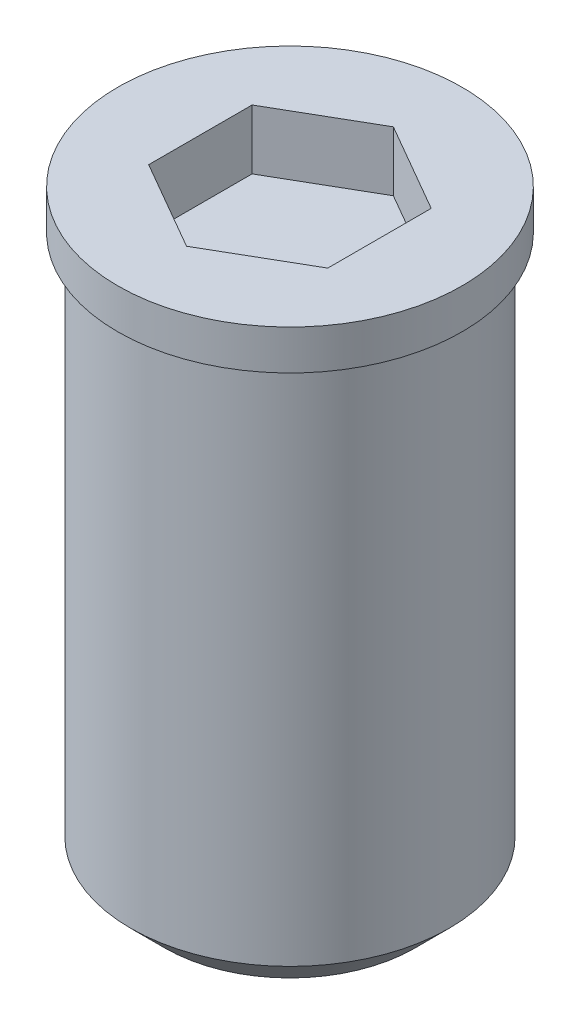
ISO-10303-21;
HEADER;
FILE_DESCRIPTION(('STEP AP214'),'2;1');
FILE_NAME('part.step','',(''),(''),'','','');
FILE_SCHEMA(('AUTOMOTIVE_DESIGN { 1 0 10303 214 1 1 1 1 }'));
ENDSEC;
DATA;
#1=APPLICATION_CONTEXT('core data for automotive mechanical design processes');
#2=APPLICATION_PROTOCOL_DEFINITION('international standard','automotive_design',2000,#1);
#3=PRODUCT_CONTEXT('',#1,'mechanical');
#4=PRODUCT('Part','Part','',(#3));
#5=PRODUCT_RELATED_PRODUCT_CATEGORY('part','',(#4));
#6=PRODUCT_DEFINITION_FORMATION('','',#4);
#7=PRODUCT_DEFINITION_CONTEXT('part definition',#1,'design');
#8=PRODUCT_DEFINITION('design','',#6,#7);
#9=PRODUCT_DEFINITION_SHAPE('','',#8);
#10=(LENGTH_UNIT() NAMED_UNIT(*) SI_UNIT(.MILLI.,.METRE.));
#11=(NAMED_UNIT(*) PLANE_ANGLE_UNIT() SI_UNIT($,.RADIAN.));
#12=(NAMED_UNIT(*) SI_UNIT($,.STERADIAN.) SOLID_ANGLE_UNIT());
#13=UNCERTAINTY_MEASURE_WITH_UNIT(LENGTH_MEASURE(1.E-05),#10,'distance_accuracy_value','');
#14=(GEOMETRIC_REPRESENTATION_CONTEXT(3) GLOBAL_UNCERTAINTY_ASSIGNED_CONTEXT((#13)) GLOBAL_UNIT_ASSIGNED_CONTEXT((#10,
#11,#12)) REPRESENTATION_CONTEXT('',''));
#15=CARTESIAN_POINT('',(0.,0.,0.));
#16=DIRECTION('',(0.,0.,1.));
#17=DIRECTION('',(1.,0.,0.));
#18=AXIS2_PLACEMENT_3D('',#15,#16,#17);
#19=CARTESIAN_POINT('',(0.,0.5,0.));
#20=DIRECTION('',(0.,-1.,0.));
#21=DIRECTION('',(0.,0.,-1.));
#22=AXIS2_PLACEMENT_3D('',#19,#20,#21);
#23=PLANE('',#22);
#24=DIRECTION('',(0.,0.,1.));
#25=VECTOR('',#24,1.);
#26=CARTESIAN_POINT('',(-1.125,0.5,-0.64951905283833));
#27=LINE('',#26,#25);
#28=CARTESIAN_POINT('',(-1.125,0.5,-0.64951905283833));
#29=VERTEX_POINT('',#28);
#30=CARTESIAN_POINT('',(-1.125,0.5,0.64951905283833));
#31=VERTEX_POINT('',#30);
#32=EDGE_CURVE('E122',#29,#31,#27,.T.);
#33=ORIENTED_EDGE('',*,*,#32,.F.);
#34=DIRECTION('',(-0.866025403784425,0.,0.500000000000024));
#35=VECTOR('',#34,1.);
#36=CARTESIAN_POINT('',(0.,0.5,-1.2990381056767));
#37=LINE('',#36,#35);
#38=CARTESIAN_POINT('',(0.,0.5,-1.2990381056767));
#39=VERTEX_POINT('',#38);
#40=EDGE_CURVE('E48',#39,#29,#37,.T.);
#41=ORIENTED_EDGE('',*,*,#40,.F.);
#42=DIRECTION('',(-0.866025403784425,0.,-0.500000000000024));
#43=VECTOR('',#42,1.);
#44=CARTESIAN_POINT('',(1.125,0.5,-0.64951905283833));
#45=LINE('',#44,#43);
#46=CARTESIAN_POINT('',(1.125,0.5,-0.64951905283833));
#47=VERTEX_POINT('',#46);
#48=EDGE_CURVE('E131',#47,#39,#45,.T.);
#49=ORIENTED_EDGE('',*,*,#48,.F.);
#50=DIRECTION('',(0.,0.,-1.));
#51=VECTOR('',#50,1.);
#52=CARTESIAN_POINT('',(1.125,0.5,0.64951905283833));
#53=LINE('',#52,#51);
#54=CARTESIAN_POINT('',(1.125,0.5,0.64951905283833));
#55=VERTEX_POINT('',#54);
#56=EDGE_CURVE('E129',#55,#47,#53,.T.);
#57=ORIENTED_EDGE('',*,*,#56,.F.);
#58=DIRECTION('',(0.866025403784425,0.,-0.500000000000024));
#59=VECTOR('',#58,1.);
#60=CARTESIAN_POINT('',(0.,0.5,1.2990381056767));
#61=LINE('',#60,#59);
#62=CARTESIAN_POINT('',(0.,0.5,1.2990381056767));
#63=VERTEX_POINT('',#62);
#64=EDGE_CURVE('E96',#63,#55,#61,.T.);
#65=ORIENTED_EDGE('',*,*,#64,.F.);
#66=DIRECTION('',(0.866025403784425,0.,0.500000000000024));
#67=VECTOR('',#66,1.);
#68=CARTESIAN_POINT('',(-1.125,0.5,0.64951905283833));
#69=LINE('',#68,#67);
#70=EDGE_CURVE('E125',#31,#63,#69,.T.);
#71=ORIENTED_EDGE('',*,*,#70,.F.);
#72=EDGE_LOOP('',(#33,#41,#49,#57,#65,#71));
#73=FACE_BOUND('',#72,.T.);
#74=CARTESIAN_POINT('',(0.,0.5,0.));
#75=DIRECTION('',(0.,1.,0.));
#76=DIRECTION('',(0.,0.,1.));
#77=AXIS2_PLACEMENT_3D('',#74,#75,#76);
#78=CIRCLE('',#77,2.1621621621622);
#79=CARTESIAN_POINT('',(0.,0.5,2.1621621621622));
#80=VERTEX_POINT('',#79);
#81=EDGE_CURVE('E11',#80,#80,#78,.T.);
#82=ORIENTED_EDGE('',*,*,#81,.T.);
#83=EDGE_LOOP('',(#82));
#84=FACE_BOUND('',#83,.T.);
#85=ADVANCED_FACE('F34',(#73,#84),#23,.F.);
#86=CARTESIAN_POINT('',(0.,-7.,0.));
#87=DIRECTION('',(0.,1.,0.));
#88=DIRECTION('',(0.,0.,1.));
#89=AXIS2_PLACEMENT_3D('',#86,#87,#88);
#90=CYLINDRICAL_SURFACE('',#89,2.1621621621622);
#91=ORIENTED_EDGE('',*,*,#81,.F.);
#92=EDGE_LOOP('',(#91));
#93=FACE_BOUND('',#92,.T.);
#94=CARTESIAN_POINT('',(0.,0.,0.));
#95=DIRECTION('',(0.,1.,0.));
#96=DIRECTION('',(0.,0.,1.));
#97=AXIS2_PLACEMENT_3D('',#94,#95,#96);
#98=CIRCLE('',#97,2.1621621621622);
#99=CARTESIAN_POINT('',(0.,0.,2.1621621621622));
#100=VERTEX_POINT('',#99);
#101=EDGE_CURVE('E41',#100,#100,#98,.T.);
#102=ORIENTED_EDGE('',*,*,#101,.T.);
#103=EDGE_LOOP('',(#102));
#104=FACE_BOUND('',#103,.T.);
#105=ADVANCED_FACE('F151',(#93,#104),#90,.T.);
#106=CARTESIAN_POINT('',(2.1621621621622,0.,0.));
#107=DIRECTION('',(0.,1.,0.));
#108=DIRECTION('',(0.,0.,1.));
#109=AXIS2_PLACEMENT_3D('',#106,#107,#108);
#110=PLANE('',#109);
#111=ORIENTED_EDGE('',*,*,#101,.F.);
#112=EDGE_LOOP('',(#111));
#113=FACE_BOUND('',#112,.T.);
#114=CARTESIAN_POINT('',(0.,0.,0.));
#115=DIRECTION('',(0.,1.,0.));
#116=DIRECTION('',(0.,0.,1.));
#117=AXIS2_PLACEMENT_3D('',#114,#115,#116);
#118=CIRCLE('',#117,2.);
#119=CARTESIAN_POINT('',(0.,0.,2.));
#120=VERTEX_POINT('',#119);
#121=EDGE_CURVE('E146',#120,#120,#118,.T.);
#122=ORIENTED_EDGE('',*,*,#121,.T.);
#123=EDGE_LOOP('',(#122));
#124=FACE_BOUND('',#123,.T.);
#125=ADVANCED_FACE('F153',(#113,#124),#110,.F.);
#126=CARTESIAN_POINT('',(0.,-7.,0.));
#127=DIRECTION('',(0.,1.,0.));
#128=DIRECTION('',(0.,0.,1.));
#129=AXIS2_PLACEMENT_3D('',#126,#127,#128);
#130=CYLINDRICAL_SURFACE('',#129,2.);
#131=ORIENTED_EDGE('',*,*,#121,.F.);
#132=EDGE_LOOP('',(#131));
#133=FACE_BOUND('',#132,.T.);
#134=CARTESIAN_POINT('',(0.,-6.5705,0.));
#135=DIRECTION('',(0.,1.,0.));
#136=DIRECTION('',(0.,0.,1.));
#137=AXIS2_PLACEMENT_3D('',#134,#135,#136);
#138=CIRCLE('',#137,2.);
#139=CARTESIAN_POINT('',(0.,-6.5705,2.));
#140=VERTEX_POINT('',#139);
#141=EDGE_CURVE('E143',#140,#140,#138,.T.);
#142=ORIENTED_EDGE('',*,*,#141,.T.);
#143=EDGE_LOOP('',(#142));
#144=FACE_BOUND('',#143,.T.);
#145=ADVANCED_FACE('F156',(#133,#144),#130,.T.);
#146=CARTESIAN_POINT('',(0.,-7.,0.));
#147=DIRECTION('',(0.,1.,0.));
#148=DIRECTION('',(0.,0.,1.));
#149=AXIS2_PLACEMENT_3D('',#146,#147,#148);
#150=CONICAL_SURFACE('',#149,1.5705,0.785398163397448);
#151=ORIENTED_EDGE('',*,*,#141,.F.);
#152=EDGE_LOOP('',(#151));
#153=FACE_BOUND('',#152,.T.);
#154=CARTESIAN_POINT('',(0.,-7.,0.));
#155=DIRECTION('',(0.,1.,0.));
#156=DIRECTION('',(0.,0.,1.));
#157=AXIS2_PLACEMENT_3D('',#154,#155,#156);
#158=CIRCLE('',#157,1.5705);
#159=CARTESIAN_POINT('',(0.,-7.,1.5705));
#160=VERTEX_POINT('',#159);
#161=EDGE_CURVE('E135',#160,#160,#158,.T.);
#162=ORIENTED_EDGE('',*,*,#161,.T.);
#163=EDGE_LOOP('',(#162));
#164=FACE_BOUND('',#163,.T.);
#165=ADVANCED_FACE('F162',(#153,#164),#150,.T.);
#166=CARTESIAN_POINT('',(1.5705,-7.,0.));
#167=DIRECTION('',(0.,1.,0.));
#168=DIRECTION('',(0.,0.,1.));
#169=AXIS2_PLACEMENT_3D('',#166,#167,#168);
#170=PLANE('',#169);
#171=ORIENTED_EDGE('',*,*,#161,.F.);
#172=EDGE_LOOP('',(#171));
#173=FACE_BOUND('',#172,.T.);
#174=ADVANCED_FACE('F168',(#173),#170,.F.);
#175=CARTESIAN_POINT('',(0.,-0.25,-1.2990381056767));
#176=DIRECTION('',(-0.500000000000024,0.,-0.866025403784425));
#177=DIRECTION('',(-0.866025403784425,0.,0.500000000000024));
#178=AXIS2_PLACEMENT_3D('',#175,#176,#177);
#179=PLANE('',#178);
#180=ORIENTED_EDGE('',*,*,#40,.T.);
#181=DIRECTION('',(0.,1.,0.));
#182=VECTOR('',#181,1.);
#183=CARTESIAN_POINT('',(-1.125,-0.25,-0.64951905283833));
#184=LINE('',#183,#182);
#185=CARTESIAN_POINT('',(-1.125,-0.25,-0.64951905283833));
#186=VERTEX_POINT('',#185);
#187=EDGE_CURVE('E78',#186,#29,#184,.T.);
#188=ORIENTED_EDGE('',*,*,#187,.F.);
#189=DIRECTION('',(-0.866025403784425,0.,0.500000000000024));
#190=VECTOR('',#189,1.);
#191=CARTESIAN_POINT('',(0.,-0.25,-1.2990381056767));
#192=LINE('',#191,#190);
#193=CARTESIAN_POINT('',(0.,-0.25,-1.2990381056767));
#194=VERTEX_POINT('',#193);
#195=EDGE_CURVE('E133',#194,#186,#192,.T.);
#196=ORIENTED_EDGE('',*,*,#195,.F.);
#197=DIRECTION('',(0.,1.,0.));
#198=VECTOR('',#197,1.);
#199=CARTESIAN_POINT('',(0.,-0.25,-1.2990381056767));
#200=LINE('',#199,#198);
#201=EDGE_CURVE('E56',#194,#39,#200,.T.);
#202=ORIENTED_EDGE('',*,*,#201,.T.);
#203=EDGE_LOOP('',(#180,#188,#196,#202));
#204=FACE_BOUND('',#203,.T.);
#205=ADVANCED_FACE('F173',(#204),#179,.F.);
#206=CARTESIAN_POINT('',(1.125,-0.25,-0.64951905283833));
#207=DIRECTION('',(0.500000000000024,0.,-0.866025403784425));
#208=DIRECTION('',(-0.866025403784425,0.,-0.500000000000024));
#209=AXIS2_PLACEMENT_3D('',#206,#207,#208);
#210=PLANE('',#209);
#211=ORIENTED_EDGE('',*,*,#48,.T.);
#212=ORIENTED_EDGE('',*,*,#201,.F.);
#213=DIRECTION('',(-0.866025403784425,0.,-0.500000000000024));
#214=VECTOR('',#213,1.);
#215=CARTESIAN_POINT('',(1.125,-0.25,-0.64951905283833));
#216=LINE('',#215,#214);
#217=CARTESIAN_POINT('',(1.125,-0.25,-0.64951905283833));
#218=VERTEX_POINT('',#217);
#219=EDGE_CURVE('E108',#218,#194,#216,.T.);
#220=ORIENTED_EDGE('',*,*,#219,.F.);
#221=DIRECTION('',(0.,1.,0.));
#222=VECTOR('',#221,1.);
#223=CARTESIAN_POINT('',(1.125,-0.25,-0.64951905283833));
#224=LINE('',#223,#222);
#225=EDGE_CURVE('E100',#218,#47,#224,.T.);
#226=ORIENTED_EDGE('',*,*,#225,.T.);
#227=EDGE_LOOP('',(#211,#212,#220,#226));
#228=FACE_BOUND('',#227,.T.);
#229=ADVANCED_FACE('F178',(#228),#210,.F.);
#230=CARTESIAN_POINT('',(1.125,-0.25,0.64951905283833));
#231=DIRECTION('',(1.,0.,0.));
#232=DIRECTION('',(0.,0.,-1.));
#233=AXIS2_PLACEMENT_3D('',#230,#231,#232);
#234=PLANE('',#233);
#235=ORIENTED_EDGE('',*,*,#56,.T.);
#236=ORIENTED_EDGE('',*,*,#225,.F.);
#237=DIRECTION('',(0.,0.,-1.));
#238=VECTOR('',#237,1.);
#239=CARTESIAN_POINT('',(1.125,-0.25,0.64951905283833));
#240=LINE('',#239,#238);
#241=CARTESIAN_POINT('',(1.125,-0.25,0.64951905283833));
#242=VERTEX_POINT('',#241);
#243=EDGE_CURVE('E104',#242,#218,#240,.T.);
#244=ORIENTED_EDGE('',*,*,#243,.F.);
#245=DIRECTION('',(0.,1.,0.));
#246=VECTOR('',#245,1.);
#247=CARTESIAN_POINT('',(1.125,-0.25,0.64951905283833));
#248=LINE('',#247,#246);
#249=EDGE_CURVE('E89',#242,#55,#248,.T.);
#250=ORIENTED_EDGE('',*,*,#249,.T.);
#251=EDGE_LOOP('',(#235,#236,#244,#250));
#252=FACE_BOUND('',#251,.T.);
#253=ADVANCED_FACE('F105',(#252),#234,.F.);
#254=CARTESIAN_POINT('',(0.,-0.25,1.2990381056767));
#255=DIRECTION('',(0.500000000000024,0.,0.866025403784425));
#256=DIRECTION('',(0.866025403784425,0.,-0.500000000000024));
#257=AXIS2_PLACEMENT_3D('',#254,#255,#256);
#258=PLANE('',#257);
#259=ORIENTED_EDGE('',*,*,#64,.T.);
#260=ORIENTED_EDGE('',*,*,#249,.F.);
#261=DIRECTION('',(0.866025403784425,0.,-0.500000000000024));
#262=VECTOR('',#261,1.);
#263=CARTESIAN_POINT('',(0.,-0.25,1.2990381056767));
#264=LINE('',#263,#262);
#265=CARTESIAN_POINT('',(0.,-0.25,1.2990381056767));
#266=VERTEX_POINT('',#265);
#267=EDGE_CURVE('E93',#266,#242,#264,.T.);
#268=ORIENTED_EDGE('',*,*,#267,.F.);
#269=DIRECTION('',(0.,1.,0.));
#270=VECTOR('',#269,1.);
#271=CARTESIAN_POINT('',(0.,-0.25,1.2990381056767));
#272=LINE('',#271,#270);
#273=EDGE_CURVE('E101',#266,#63,#272,.T.);
#274=ORIENTED_EDGE('',*,*,#273,.T.);
#275=EDGE_LOOP('',(#259,#260,#268,#274));
#276=FACE_BOUND('',#275,.T.);
#277=ADVANCED_FACE('F91',(#276),#258,.F.);
#278=CARTESIAN_POINT('',(-1.125,-0.25,0.64951905283833));
#279=DIRECTION('',(-0.500000000000024,0.,0.866025403784425));
#280=DIRECTION('',(0.866025403784425,0.,0.500000000000024));
#281=AXIS2_PLACEMENT_3D('',#278,#279,#280);
#282=PLANE('',#281);
#283=ORIENTED_EDGE('',*,*,#70,.T.);
#284=ORIENTED_EDGE('',*,*,#273,.F.);
#285=DIRECTION('',(0.866025403784425,0.,0.500000000000024));
#286=VECTOR('',#285,1.);
#287=CARTESIAN_POINT('',(-1.125,-0.25,0.64951905283833));
#288=LINE('',#287,#286);
#289=CARTESIAN_POINT('',(-1.125,-0.25,0.64951905283833));
#290=VERTEX_POINT('',#289);
#291=EDGE_CURVE('E114',#290,#266,#288,.T.);
#292=ORIENTED_EDGE('',*,*,#291,.F.);
#293=DIRECTION('',(0.,1.,0.));
#294=VECTOR('',#293,1.);
#295=CARTESIAN_POINT('',(-1.125,-0.25,0.64951905283833));
#296=LINE('',#295,#294);
#297=EDGE_CURVE('E138',#290,#31,#296,.T.);
#298=ORIENTED_EDGE('',*,*,#297,.T.);
#299=EDGE_LOOP('',(#283,#284,#292,#298));
#300=FACE_BOUND('',#299,.T.);
#301=ADVANCED_FACE('F204',(#300),#282,.F.);
#302=CARTESIAN_POINT('',(-1.125,-0.25,-0.64951905283833));
#303=DIRECTION('',(-1.,0.,0.));
#304=DIRECTION('',(0.,0.,1.));
#305=AXIS2_PLACEMENT_3D('',#302,#303,#304);
#306=PLANE('',#305);
#307=ORIENTED_EDGE('',*,*,#32,.T.);
#308=ORIENTED_EDGE('',*,*,#297,.F.);
#309=DIRECTION('',(0.,0.,1.));
#310=VECTOR('',#309,1.);
#311=CARTESIAN_POINT('',(-1.125,-0.25,-0.64951905283833));
#312=LINE('',#311,#310);
#313=EDGE_CURVE('E116',#186,#290,#312,.T.);
#314=ORIENTED_EDGE('',*,*,#313,.F.);
#315=ORIENTED_EDGE('',*,*,#187,.T.);
#316=EDGE_LOOP('',(#307,#308,#314,#315));
#317=FACE_BOUND('',#316,.T.);
#318=ADVANCED_FACE('F192',(#317),#306,.F.);
#319=CARTESIAN_POINT('',(0.,-0.25,0.));
#320=DIRECTION('',(0.,1.,0.));
#321=DIRECTION('',(0.,0.,1.));
#322=AXIS2_PLACEMENT_3D('',#319,#320,#321);
#323=PLANE('',#322);
#324=ORIENTED_EDGE('',*,*,#195,.T.);
#325=ORIENTED_EDGE('',*,*,#313,.T.);
#326=ORIENTED_EDGE('',*,*,#291,.T.);
#327=ORIENTED_EDGE('',*,*,#267,.T.);
#328=ORIENTED_EDGE('',*,*,#243,.T.);
#329=ORIENTED_EDGE('',*,*,#219,.T.);
#330=EDGE_LOOP('',(#324,#325,#326,#327,#328,#329));
#331=FACE_BOUND('',#330,.T.);
#332=ADVANCED_FACE('F111',(#331),#323,.T.);
#333=CLOSED_SHELL('',(#85,#105,#125,#145,#165,#174,#205,#229,#253,#277,#301,#318,#332));
#334=MANIFOLD_SOLID_BREP('B2',#333);
#335=ADVANCED_BREP_SHAPE_REPRESENTATION('',(#18,#334),#14);
#336=SHAPE_DEFINITION_REPRESENTATION(#9,#335);
ENDSEC;
END-ISO-10303-21;
